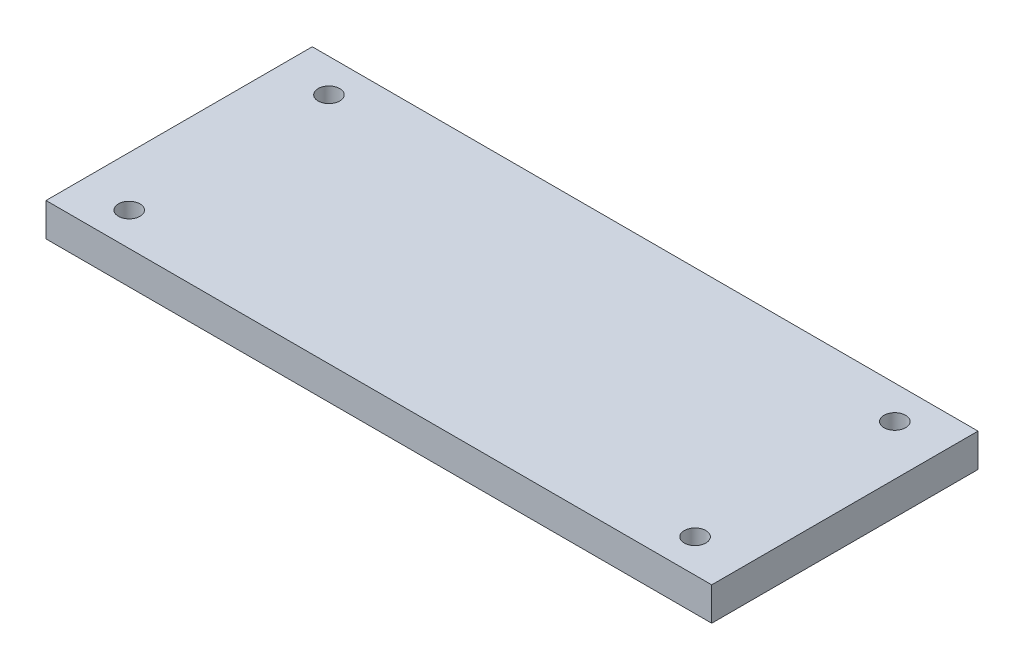
ISO-10303-21;
HEADER;
FILE_DESCRIPTION(('STEP AP214'),'2;1');
FILE_NAME('part.step','',(''),(''),'','','');
FILE_SCHEMA(('AUTOMOTIVE_DESIGN { 1 0 10303 214 1 1 1 1 }'));
ENDSEC;
DATA;
#1=APPLICATION_CONTEXT('core data for automotive mechanical design processes');
#2=APPLICATION_PROTOCOL_DEFINITION('international standard','automotive_design',2000,#1);
#3=PRODUCT_CONTEXT('',#1,'mechanical');
#4=PRODUCT('Part','Part','',(#3));
#5=PRODUCT_RELATED_PRODUCT_CATEGORY('part','',(#4));
#6=PRODUCT_DEFINITION_FORMATION('','',#4);
#7=PRODUCT_DEFINITION_CONTEXT('part definition',#1,'design');
#8=PRODUCT_DEFINITION('design','',#6,#7);
#9=PRODUCT_DEFINITION_SHAPE('','',#8);
#10=(LENGTH_UNIT() NAMED_UNIT(*) SI_UNIT(.MILLI.,.METRE.));
#11=(NAMED_UNIT(*) PLANE_ANGLE_UNIT() SI_UNIT($,.RADIAN.));
#12=(NAMED_UNIT(*) SI_UNIT($,.STERADIAN.) SOLID_ANGLE_UNIT());
#13=UNCERTAINTY_MEASURE_WITH_UNIT(LENGTH_MEASURE(1.E-05),#10,'distance_accuracy_value','');
#14=(GEOMETRIC_REPRESENTATION_CONTEXT(3) GLOBAL_UNCERTAINTY_ASSIGNED_CONTEXT((#13)) GLOBAL_UNIT_ASSIGNED_CONTEXT((#10,
#11,#12)) REPRESENTATION_CONTEXT('',''));
#15=CARTESIAN_POINT('',(0.,0.,0.));
#16=DIRECTION('',(0.,0.,1.));
#17=DIRECTION('',(1.,0.,0.));
#18=AXIS2_PLACEMENT_3D('',#15,#16,#17);
#19=CARTESIAN_POINT('',(-100.,10.,-40.));
#20=DIRECTION('',(1.,0.,0.));
#21=DIRECTION('',(0.,0.,-1.));
#22=AXIS2_PLACEMENT_3D('',#19,#20,#21);
#23=PLANE('',#22);
#24=DIRECTION('',(0.,0.,1.));
#25=VECTOR('',#24,1.);
#26=CARTESIAN_POINT('',(-100.,0.,-40.));
#27=LINE('',#26,#25);
#28=CARTESIAN_POINT('',(-100.,0.,-40.));
#29=VERTEX_POINT('',#28);
#30=CARTESIAN_POINT('',(-100.,0.,40.));
#31=VERTEX_POINT('',#30);
#32=EDGE_CURVE('E130',#29,#31,#27,.T.);
#33=ORIENTED_EDGE('',*,*,#32,.T.);
#34=DIRECTION('',(0.,-1.,0.));
#35=VECTOR('',#34,1.);
#36=CARTESIAN_POINT('',(-100.,10.,40.));
#37=LINE('',#36,#35);
#38=CARTESIAN_POINT('',(-100.,10.,40.));
#39=VERTEX_POINT('',#38);
#40=EDGE_CURVE('E13',#39,#31,#37,.T.);
#41=ORIENTED_EDGE('',*,*,#40,.F.);
#42=DIRECTION('',(0.,0.,1.));
#43=VECTOR('',#42,1.);
#44=CARTESIAN_POINT('',(-100.,10.,-40.));
#45=LINE('',#44,#43);
#46=CARTESIAN_POINT('',(-100.,10.,-40.));
#47=VERTEX_POINT('',#46);
#48=EDGE_CURVE('E112',#47,#39,#45,.T.);
#49=ORIENTED_EDGE('',*,*,#48,.F.);
#50=DIRECTION('',(0.,-1.,0.));
#51=VECTOR('',#50,1.);
#52=CARTESIAN_POINT('',(-100.,10.,-40.));
#53=LINE('',#52,#51);
#54=EDGE_CURVE('E125',#47,#29,#53,.T.);
#55=ORIENTED_EDGE('',*,*,#54,.T.);
#56=EDGE_LOOP('',(#33,#41,#49,#55));
#57=FACE_BOUND('',#56,.T.);
#58=ADVANCED_FACE('F56',(#57),#23,.F.);
#59=CARTESIAN_POINT('',(100.,10.,40.));
#60=DIRECTION('',(0.,0.,-1.));
#61=DIRECTION('',(-1.,0.,0.));
#62=AXIS2_PLACEMENT_3D('',#59,#60,#61);
#63=PLANE('',#62);
#64=DIRECTION('',(1.,0.,0.));
#65=VECTOR('',#64,1.);
#66=CARTESIAN_POINT('',(100.,0.,40.));
#67=LINE('',#66,#65);
#68=CARTESIAN_POINT('',(100.,0.,40.));
#69=VERTEX_POINT('',#68);
#70=EDGE_CURVE('E119',#31,#69,#67,.T.);
#71=ORIENTED_EDGE('',*,*,#70,.T.);
#72=DIRECTION('',(0.,-1.,0.));
#73=VECTOR('',#72,1.);
#74=CARTESIAN_POINT('',(100.,10.,40.));
#75=LINE('',#74,#73);
#76=CARTESIAN_POINT('',(100.,10.,40.));
#77=VERTEX_POINT('',#76);
#78=EDGE_CURVE('E70',#77,#69,#75,.T.);
#79=ORIENTED_EDGE('',*,*,#78,.F.);
#80=DIRECTION('',(1.,0.,0.));
#81=VECTOR('',#80,1.);
#82=CARTESIAN_POINT('',(100.,10.,40.));
#83=LINE('',#82,#81);
#84=EDGE_CURVE('E106',#39,#77,#83,.T.);
#85=ORIENTED_EDGE('',*,*,#84,.F.);
#86=ORIENTED_EDGE('',*,*,#40,.T.);
#87=EDGE_LOOP('',(#71,#79,#85,#86));
#88=FACE_BOUND('',#87,.T.);
#89=ADVANCED_FACE('F113',(#88),#63,.F.);
#90=CARTESIAN_POINT('',(100.,10.,-40.));
#91=DIRECTION('',(-1.,0.,0.));
#92=DIRECTION('',(0.,0.,1.));
#93=AXIS2_PLACEMENT_3D('',#90,#91,#92);
#94=PLANE('',#93);
#95=DIRECTION('',(0.,0.,-1.));
#96=VECTOR('',#95,1.);
#97=CARTESIAN_POINT('',(100.,0.,-40.));
#98=LINE('',#97,#96);
#99=CARTESIAN_POINT('',(100.,0.,-40.));
#100=VERTEX_POINT('',#99);
#101=EDGE_CURVE('E91',#69,#100,#98,.T.);
#102=ORIENTED_EDGE('',*,*,#101,.T.);
#103=DIRECTION('',(0.,-1.,0.));
#104=VECTOR('',#103,1.);
#105=CARTESIAN_POINT('',(100.,10.,-40.));
#106=LINE('',#105,#104);
#107=CARTESIAN_POINT('',(100.,10.,-40.));
#108=VERTEX_POINT('',#107);
#109=EDGE_CURVE('E120',#108,#100,#106,.T.);
#110=ORIENTED_EDGE('',*,*,#109,.F.);
#111=DIRECTION('',(0.,0.,-1.));
#112=VECTOR('',#111,1.);
#113=CARTESIAN_POINT('',(100.,10.,-40.));
#114=LINE('',#113,#112);
#115=EDGE_CURVE('E108',#77,#108,#114,.T.);
#116=ORIENTED_EDGE('',*,*,#115,.F.);
#117=ORIENTED_EDGE('',*,*,#78,.T.);
#118=EDGE_LOOP('',(#102,#110,#116,#117));
#119=FACE_BOUND('',#118,.T.);
#120=ADVANCED_FACE('F118',(#119),#94,.F.);
#121=CARTESIAN_POINT('',(100.,10.,-40.));
#122=DIRECTION('',(0.,0.,1.));
#123=DIRECTION('',(1.,0.,0.));
#124=AXIS2_PLACEMENT_3D('',#121,#122,#123);
#125=PLANE('',#124);
#126=DIRECTION('',(-1.,0.,0.));
#127=VECTOR('',#126,1.);
#128=CARTESIAN_POINT('',(100.,0.,-40.));
#129=LINE('',#128,#127);
#130=EDGE_CURVE('E97',#100,#29,#129,.T.);
#131=ORIENTED_EDGE('',*,*,#130,.T.);
#132=ORIENTED_EDGE('',*,*,#54,.F.);
#133=DIRECTION('',(-1.,0.,0.));
#134=VECTOR('',#133,1.);
#135=CARTESIAN_POINT('',(100.,10.,-40.));
#136=LINE('',#135,#134);
#137=EDGE_CURVE('E79',#108,#47,#136,.T.);
#138=ORIENTED_EDGE('',*,*,#137,.F.);
#139=ORIENTED_EDGE('',*,*,#109,.T.);
#140=EDGE_LOOP('',(#131,#132,#138,#139));
#141=FACE_BOUND('',#140,.T.);
#142=ADVANCED_FACE('F143',(#141),#125,.F.);
#143=CARTESIAN_POINT('',(0.,10.,0.));
#144=DIRECTION('',(0.,-1.,0.));
#145=DIRECTION('',(0.,0.,-1.));
#146=AXIS2_PLACEMENT_3D('',#143,#144,#145);
#147=PLANE('',#146);
#148=CARTESIAN_POINT('',(-85.,10.,30.));
#149=DIRECTION('',(0.,1.,0.));
#150=DIRECTION('',(0.,0.,-1.));
#151=AXIS2_PLACEMENT_3D('',#148,#149,#150);
#152=CIRCLE('',#151,3.25000000000001);
#153=CARTESIAN_POINT('',(-85.,10.,26.75));
#154=VERTEX_POINT('',#153);
#155=EDGE_CURVE('E159',#154,#154,#152,.T.);
#156=ORIENTED_EDGE('',*,*,#155,.F.);
#157=EDGE_LOOP('',(#156));
#158=FACE_BOUND('',#157,.T.);
#159=CARTESIAN_POINT('',(85.,10.,30.));
#160=DIRECTION('',(0.,1.,0.));
#161=DIRECTION('',(0.,0.,1.));
#162=AXIS2_PLACEMENT_3D('',#159,#160,#161);
#163=CIRCLE('',#162,3.25000000000001);
#164=CARTESIAN_POINT('',(85.,10.,33.25));
#165=VERTEX_POINT('',#164);
#166=EDGE_CURVE('E169',#165,#165,#163,.T.);
#167=ORIENTED_EDGE('',*,*,#166,.F.);
#168=EDGE_LOOP('',(#167));
#169=FACE_BOUND('',#168,.T.);
#170=CARTESIAN_POINT('',(85.,10.,-30.));
#171=DIRECTION('',(0.,1.,0.));
#172=DIRECTION('',(0.,0.,-1.));
#173=AXIS2_PLACEMENT_3D('',#170,#171,#172);
#174=CIRCLE('',#173,3.25000000000001);
#175=CARTESIAN_POINT('',(85.,10.,-33.25));
#176=VERTEX_POINT('',#175);
#177=EDGE_CURVE('E155',#176,#176,#174,.T.);
#178=ORIENTED_EDGE('',*,*,#177,.F.);
#179=EDGE_LOOP('',(#178));
#180=FACE_BOUND('',#179,.T.);
#181=CARTESIAN_POINT('',(-85.,10.,-30.));
#182=DIRECTION('',(0.,1.,0.));
#183=DIRECTION('',(0.,0.,1.));
#184=AXIS2_PLACEMENT_3D('',#181,#182,#183);
#185=CIRCLE('',#184,3.25000000000001);
#186=CARTESIAN_POINT('',(-85.,10.,-26.75));
#187=VERTEX_POINT('',#186);
#188=EDGE_CURVE('E146',#187,#187,#185,.T.);
#189=ORIENTED_EDGE('',*,*,#188,.F.);
#190=EDGE_LOOP('',(#189));
#191=FACE_BOUND('',#190,.T.);
#192=ORIENTED_EDGE('',*,*,#48,.T.);
#193=ORIENTED_EDGE('',*,*,#84,.T.);
#194=ORIENTED_EDGE('',*,*,#115,.T.);
#195=ORIENTED_EDGE('',*,*,#137,.T.);
#196=EDGE_LOOP('',(#192,#193,#194,#195));
#197=FACE_BOUND('',#196,.T.);
#198=ADVANCED_FACE('F110',(#158,#169,#180,#191,#197),#147,.F.);
#199=CARTESIAN_POINT('',(0.,0.,0.));
#200=DIRECTION('',(0.,-1.,0.));
#201=DIRECTION('',(0.,0.,-1.));
#202=AXIS2_PLACEMENT_3D('',#199,#200,#201);
#203=PLANE('',#202);
#204=CARTESIAN_POINT('',(-85.,0.,30.));
#205=DIRECTION('',(0.,1.,0.));
#206=DIRECTION('',(0.,0.,-1.));
#207=AXIS2_PLACEMENT_3D('',#204,#205,#206);
#208=CIRCLE('',#207,3.25000000000001);
#209=CARTESIAN_POINT('',(-85.,0.,26.75));
#210=VERTEX_POINT('',#209);
#211=EDGE_CURVE('E156',#210,#210,#208,.T.);
#212=ORIENTED_EDGE('',*,*,#211,.T.);
#213=EDGE_LOOP('',(#212));
#214=FACE_BOUND('',#213,.T.);
#215=CARTESIAN_POINT('',(85.,0.,30.));
#216=DIRECTION('',(0.,1.,0.));
#217=DIRECTION('',(0.,0.,1.));
#218=AXIS2_PLACEMENT_3D('',#215,#216,#217);
#219=CIRCLE('',#218,3.25000000000001);
#220=CARTESIAN_POINT('',(85.,0.,33.25));
#221=VERTEX_POINT('',#220);
#222=EDGE_CURVE('E163',#221,#221,#219,.T.);
#223=ORIENTED_EDGE('',*,*,#222,.T.);
#224=EDGE_LOOP('',(#223));
#225=FACE_BOUND('',#224,.T.);
#226=CARTESIAN_POINT('',(85.,0.,-30.));
#227=DIRECTION('',(0.,1.,0.));
#228=DIRECTION('',(0.,0.,-1.));
#229=AXIS2_PLACEMENT_3D('',#226,#227,#228);
#230=CIRCLE('',#229,3.25000000000001);
#231=CARTESIAN_POINT('',(85.,0.,-33.25));
#232=VERTEX_POINT('',#231);
#233=EDGE_CURVE('E171',#232,#232,#230,.T.);
#234=ORIENTED_EDGE('',*,*,#233,.T.);
#235=EDGE_LOOP('',(#234));
#236=FACE_BOUND('',#235,.T.);
#237=CARTESIAN_POINT('',(-85.,0.,-30.));
#238=DIRECTION('',(0.,1.,0.));
#239=DIRECTION('',(0.,0.,1.));
#240=AXIS2_PLACEMENT_3D('',#237,#238,#239);
#241=CIRCLE('',#240,3.25000000000001);
#242=CARTESIAN_POINT('',(-85.,0.,-26.75));
#243=VERTEX_POINT('',#242);
#244=EDGE_CURVE('E134',#243,#243,#241,.T.);
#245=ORIENTED_EDGE('',*,*,#244,.T.);
#246=EDGE_LOOP('',(#245));
#247=FACE_BOUND('',#246,.T.);
#248=ORIENTED_EDGE('',*,*,#32,.F.);
#249=ORIENTED_EDGE('',*,*,#130,.F.);
#250=ORIENTED_EDGE('',*,*,#101,.F.);
#251=ORIENTED_EDGE('',*,*,#70,.F.);
#252=EDGE_LOOP('',(#248,#249,#250,#251));
#253=FACE_BOUND('',#252,.T.);
#254=ADVANCED_FACE('F145',(#214,#225,#236,#247,#253),#203,.T.);
#255=CARTESIAN_POINT('',(-85.,0.,-30.));
#256=DIRECTION('',(0.,1.,0.));
#257=DIRECTION('',(0.,0.,1.));
#258=AXIS2_PLACEMENT_3D('',#255,#256,#257);
#259=CYLINDRICAL_SURFACE('',#258,3.25000000000001);
#260=ORIENTED_EDGE('',*,*,#244,.F.);
#261=EDGE_LOOP('',(#260));
#262=FACE_BOUND('',#261,.T.);
#263=ORIENTED_EDGE('',*,*,#188,.T.);
#264=EDGE_LOOP('',(#263));
#265=FACE_BOUND('',#264,.T.);
#266=ADVANCED_FACE('F190',(#262,#265),#259,.F.);
#267=CARTESIAN_POINT('',(85.,0.,-30.));
#268=DIRECTION('',(0.,1.,0.));
#269=DIRECTION('',(0.,0.,1.));
#270=AXIS2_PLACEMENT_3D('',#267,#268,#269);
#271=CYLINDRICAL_SURFACE('',#270,3.25000000000001);
#272=ORIENTED_EDGE('',*,*,#233,.F.);
#273=EDGE_LOOP('',(#272));
#274=FACE_BOUND('',#273,.T.);
#275=ORIENTED_EDGE('',*,*,#177,.T.);
#276=EDGE_LOOP('',(#275));
#277=FACE_BOUND('',#276,.T.);
#278=ADVANCED_FACE('F177',(#274,#277),#271,.F.);
#279=CARTESIAN_POINT('',(85.,0.,30.));
#280=DIRECTION('',(0.,1.,0.));
#281=DIRECTION('',(0.,0.,1.));
#282=AXIS2_PLACEMENT_3D('',#279,#280,#281);
#283=CYLINDRICAL_SURFACE('',#282,3.25000000000001);
#284=ORIENTED_EDGE('',*,*,#222,.F.);
#285=EDGE_LOOP('',(#284));
#286=FACE_BOUND('',#285,.T.);
#287=ORIENTED_EDGE('',*,*,#166,.T.);
#288=EDGE_LOOP('',(#287));
#289=FACE_BOUND('',#288,.T.);
#290=ADVANCED_FACE('F197',(#286,#289),#283,.F.);
#291=CARTESIAN_POINT('',(-85.,0.,30.));
#292=DIRECTION('',(0.,1.,0.));
#293=DIRECTION('',(0.,0.,1.));
#294=AXIS2_PLACEMENT_3D('',#291,#292,#293);
#295=CYLINDRICAL_SURFACE('',#294,3.25000000000001);
#296=ORIENTED_EDGE('',*,*,#211,.F.);
#297=EDGE_LOOP('',(#296));
#298=FACE_BOUND('',#297,.T.);
#299=ORIENTED_EDGE('',*,*,#155,.T.);
#300=EDGE_LOOP('',(#299));
#301=FACE_BOUND('',#300,.T.);
#302=ADVANCED_FACE('F238',(#298,#301),#295,.F.);
#303=CLOSED_SHELL('',(#58,#89,#120,#142,#198,#254,#266,#278,#290,#302));
#304=MANIFOLD_SOLID_BREP('B2',#303);
#305=ADVANCED_BREP_SHAPE_REPRESENTATION('',(#18,#304),#14);
#306=SHAPE_DEFINITION_REPRESENTATION(#9,#305);
ENDSEC;
END-ISO-10303-21;
